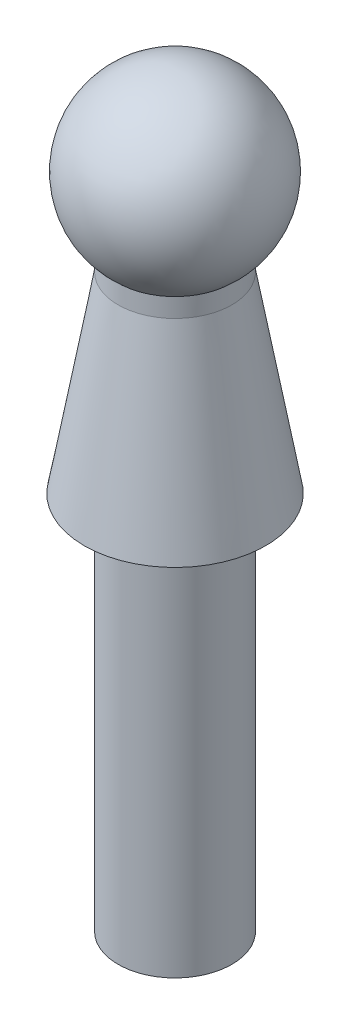
ISO-10303-21;
HEADER;
FILE_DESCRIPTION(('STEP AP214'),'2;1');
FILE_NAME('part.step','',(''),(''),'','','');
FILE_SCHEMA(('AUTOMOTIVE_DESIGN { 1 0 10303 214 1 1 1 1 }'));
ENDSEC;
DATA;
#1=APPLICATION_CONTEXT('core data for automotive mechanical design processes');
#2=APPLICATION_PROTOCOL_DEFINITION('international standard','automotive_design',2000,#1);
#3=PRODUCT_CONTEXT('',#1,'mechanical');
#4=PRODUCT('Part','Part','',(#3));
#5=PRODUCT_RELATED_PRODUCT_CATEGORY('part','',(#4));
#6=PRODUCT_DEFINITION_FORMATION('','',#4);
#7=PRODUCT_DEFINITION_CONTEXT('part definition',#1,'design');
#8=PRODUCT_DEFINITION('design','',#6,#7);
#9=PRODUCT_DEFINITION_SHAPE('','',#8);
#10=(LENGTH_UNIT() NAMED_UNIT(*) SI_UNIT(.MILLI.,.METRE.));
#11=(NAMED_UNIT(*) PLANE_ANGLE_UNIT() SI_UNIT($,.RADIAN.));
#12=(NAMED_UNIT(*) SI_UNIT($,.STERADIAN.) SOLID_ANGLE_UNIT());
#13=UNCERTAINTY_MEASURE_WITH_UNIT(LENGTH_MEASURE(1.E-05),#10,'distance_accuracy_value','');
#14=(GEOMETRIC_REPRESENTATION_CONTEXT(3) GLOBAL_UNCERTAINTY_ASSIGNED_CONTEXT((#13)) GLOBAL_UNIT_ASSIGNED_CONTEXT((#10,
#11,#12)) REPRESENTATION_CONTEXT('',''));
#15=CARTESIAN_POINT('',(0.,0.,0.));
#16=DIRECTION('',(0.,0.,1.));
#17=DIRECTION('',(1.,0.,0.));
#18=AXIS2_PLACEMENT_3D('',#15,#16,#17);
#19=CARTESIAN_POINT('',(0.,0.,0.));
#20=DIRECTION('',(0.,-1.,0.));
#21=DIRECTION('',(0.,0.,-1.));
#22=AXIS2_PLACEMENT_3D('',#19,#20,#21);
#23=PLANE('',#22);
#24=CARTESIAN_POINT('',(0.,0.,0.));
#25=DIRECTION('',(0.,-1.,0.));
#26=DIRECTION('',(0.,0.,-1.));
#27=AXIS2_PLACEMENT_3D('',#24,#25,#26);
#28=CIRCLE('',#27,6.);
#29=CARTESIAN_POINT('',(0.,0.,-6.));
#30=VERTEX_POINT('',#29);
#31=EDGE_CURVE('E10',#30,#30,#28,.T.);
#32=ORIENTED_EDGE('',*,*,#31,.T.);
#33=EDGE_LOOP('',(#32));
#34=FACE_BOUND('',#33,.T.);
#35=ADVANCED_FACE('F34',(#34),#23,.T.);
#36=CARTESIAN_POINT('',(0.,0.,0.));
#37=DIRECTION('',(0.,-1.,0.));
#38=DIRECTION('',(0.,0.,-1.));
#39=AXIS2_PLACEMENT_3D('',#36,#37,#38);
#40=CYLINDRICAL_SURFACE('',#39,6.);
#41=CARTESIAN_POINT('',(0.,40.,0.));
#42=DIRECTION('',(0.,-1.,0.));
#43=DIRECTION('',(0.,0.,-1.));
#44=AXIS2_PLACEMENT_3D('',#41,#42,#43);
#45=CIRCLE('',#44,6.);
#46=CARTESIAN_POINT('',(0.,40.,-6.));
#47=VERTEX_POINT('',#46);
#48=EDGE_CURVE('E40',#47,#47,#45,.T.);
#49=ORIENTED_EDGE('',*,*,#48,.T.);
#50=EDGE_LOOP('',(#49));
#51=FACE_BOUND('',#50,.T.);
#52=ORIENTED_EDGE('',*,*,#31,.F.);
#53=EDGE_LOOP('',(#52));
#54=FACE_BOUND('',#53,.T.);
#55=ADVANCED_FACE('F69',(#51,#54),#40,.T.);
#56=CARTESIAN_POINT('',(6.,40.,0.));
#57=DIRECTION('',(0.,-1.,0.));
#58=DIRECTION('',(0.,0.,-1.));
#59=AXIS2_PLACEMENT_3D('',#56,#57,#58);
#60=PLANE('',#59);
#61=CARTESIAN_POINT('',(0.,40.,0.));
#62=DIRECTION('',(0.,-1.,0.));
#63=DIRECTION('',(0.,0.,-1.));
#64=AXIS2_PLACEMENT_3D('',#61,#62,#63);
#65=CIRCLE('',#64,9.56326980708466);
#66=CARTESIAN_POINT('',(0.,40.,-9.56326980708466));
#67=VERTEX_POINT('',#66);
#68=EDGE_CURVE('E44',#67,#67,#65,.T.);
#69=ORIENTED_EDGE('',*,*,#68,.T.);
#70=EDGE_LOOP('',(#69));
#71=FACE_BOUND('',#70,.T.);
#72=ORIENTED_EDGE('',*,*,#48,.F.);
#73=EDGE_LOOP('',(#72));
#74=FACE_BOUND('',#73,.T.);
#75=ADVANCED_FACE('F73',(#71,#74),#60,.T.);
#76=CARTESIAN_POINT('',(0.,40.,0.));
#77=DIRECTION('',(0.,-1.,0.));
#78=DIRECTION('',(0.,0.,-1.));
#79=AXIS2_PLACEMENT_3D('',#76,#77,#78);
#80=CONICAL_SURFACE('',#79,9.56326980708466,0.174532925199434);
#81=CARTESIAN_POINT('',(0.,60.2083072753118,0.));
#82=DIRECTION('',(0.,-1.,0.));
#83=DIRECTION('',(0.,0.,-1.));
#84=AXIS2_PLACEMENT_3D('',#81,#82,#83);
#85=CIRCLE('',#84,6.);
#86=CARTESIAN_POINT('',(0.,60.2083072753118,-6.));
#87=VERTEX_POINT('',#86);
#88=EDGE_CURVE('E48',#87,#87,#85,.T.);
#89=ORIENTED_EDGE('',*,*,#88,.T.);
#90=EDGE_LOOP('',(#89));
#91=FACE_BOUND('',#90,.T.);
#92=ORIENTED_EDGE('',*,*,#68,.F.);
#93=EDGE_LOOP('',(#92));
#94=FACE_BOUND('',#93,.T.);
#95=ADVANCED_FACE('F66',(#91,#94),#80,.T.);
#96=CARTESIAN_POINT('',(0.,0.,0.));
#97=DIRECTION('',(0.,-1.,0.));
#98=DIRECTION('',(0.,0.,-1.));
#99=AXIS2_PLACEMENT_3D('',#96,#97,#98);
#100=CYLINDRICAL_SURFACE('',#99,6.);
#101=CARTESIAN_POINT('',(0.,62.2083072753118,0.));
#102=DIRECTION('',(0.,-1.,0.));
#103=DIRECTION('',(0.,0.,-1.));
#104=AXIS2_PLACEMENT_3D('',#101,#102,#103);
#105=CIRCLE('',#104,6.);
#106=CARTESIAN_POINT('',(0.,62.2083072753118,-6.));
#107=VERTEX_POINT('',#106);
#108=EDGE_CURVE('E53',#107,#107,#105,.T.);
#109=ORIENTED_EDGE('',*,*,#108,.T.);
#110=EDGE_LOOP('',(#109));
#111=FACE_BOUND('',#110,.T.);
#112=ORIENTED_EDGE('',*,*,#88,.F.);
#113=EDGE_LOOP('',(#112));
#114=FACE_BOUND('',#113,.T.);
#115=ADVANCED_FACE('F57',(#111,#114),#100,.T.);
#116=CARTESIAN_POINT('',(0.,69.3922894579178,0.));
#117=DIRECTION('',(0.,-1.,0.));
#118=DIRECTION('',(1.,0.,0.));
#119=AXIS2_PLACEMENT_3D('',#116,#117,#118);
#120=SPHERICAL_SURFACE('',#119,9.36);
#121=ORIENTED_EDGE('',*,*,#108,.F.);
#122=EDGE_LOOP('',(#121));
#123=FACE_BOUND('',#122,.T.);
#124=ADVANCED_FACE('F60',(#123),#120,.T.);
#125=CLOSED_SHELL('',(#35,#55,#75,#95,#115,#124));
#126=MANIFOLD_SOLID_BREP('B2',#125);
#127=ADVANCED_BREP_SHAPE_REPRESENTATION('',(#18,#126),#14);
#128=SHAPE_DEFINITION_REPRESENTATION(#9,#127);
ENDSEC;
END-ISO-10303-21;
